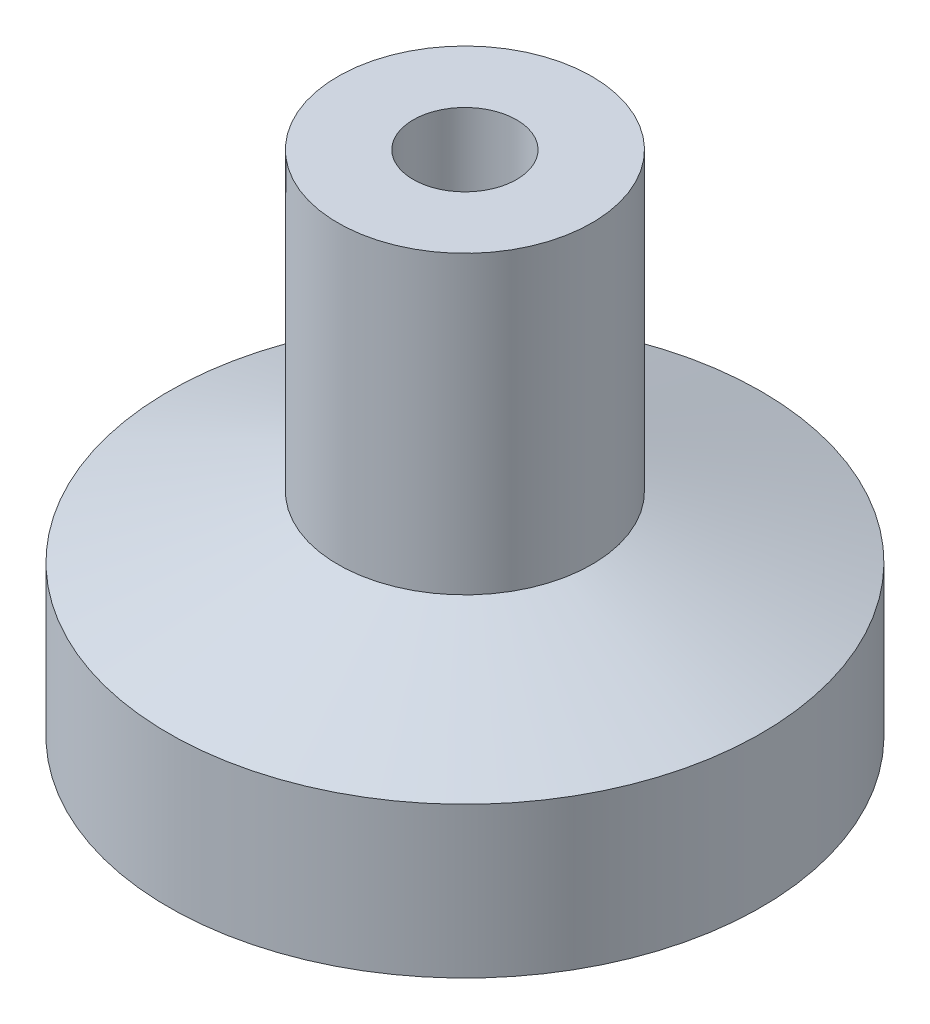
ISO-10303-21;
HEADER;
FILE_DESCRIPTION(('STEP AP214'),'2;1');
FILE_NAME('part.step','',(''),(''),'','','');
FILE_SCHEMA(('AUTOMOTIVE_DESIGN { 1 0 10303 214 1 1 1 1 }'));
ENDSEC;
DATA;
#1=APPLICATION_CONTEXT('core data for automotive mechanical design processes');
#2=APPLICATION_PROTOCOL_DEFINITION('international standard','automotive_design',2000,#1);
#3=PRODUCT_CONTEXT('',#1,'mechanical');
#4=PRODUCT('Part','Part','',(#3));
#5=PRODUCT_RELATED_PRODUCT_CATEGORY('part','',(#4));
#6=PRODUCT_DEFINITION_FORMATION('','',#4);
#7=PRODUCT_DEFINITION_CONTEXT('part definition',#1,'design');
#8=PRODUCT_DEFINITION('design','',#6,#7);
#9=PRODUCT_DEFINITION_SHAPE('','',#8);
#10=(LENGTH_UNIT() NAMED_UNIT(*) SI_UNIT(.MILLI.,.METRE.));
#11=(NAMED_UNIT(*) PLANE_ANGLE_UNIT() SI_UNIT($,.RADIAN.));
#12=(NAMED_UNIT(*) SI_UNIT($,.STERADIAN.) SOLID_ANGLE_UNIT());
#13=UNCERTAINTY_MEASURE_WITH_UNIT(LENGTH_MEASURE(1.E-05),#10,'distance_accuracy_value','');
#14=(GEOMETRIC_REPRESENTATION_CONTEXT(3) GLOBAL_UNCERTAINTY_ASSIGNED_CONTEXT((#13)) GLOBAL_UNIT_ASSIGNED_CONTEXT((#10,
#11,#12)) REPRESENTATION_CONTEXT('',''));
#15=CARTESIAN_POINT('',(0.,0.,0.));
#16=DIRECTION('',(0.,0.,1.));
#17=DIRECTION('',(1.,0.,0.));
#18=AXIS2_PLACEMENT_3D('',#15,#16,#17);
#19=CARTESIAN_POINT('',(0.,0.,0.));
#20=DIRECTION('',(0.,-1.,0.));
#21=DIRECTION('',(0.,0.,-1.));
#22=AXIS2_PLACEMENT_3D('',#19,#20,#21);
#23=CYLINDRICAL_SURFACE('',#22,2.75);
#24=CARTESIAN_POINT('',(0.,27.,0.));
#25=DIRECTION('',(0.,-1.,0.));
#26=DIRECTION('',(0.,0.,-1.));
#27=AXIS2_PLACEMENT_3D('',#24,#25,#26);
#28=CIRCLE('',#27,2.75);
#29=CARTESIAN_POINT('',(0.,27.,-2.75));
#30=VERTEX_POINT('',#29);
#31=EDGE_CURVE('E10',#30,#30,#28,.T.);
#32=ORIENTED_EDGE('',*,*,#31,.F.);
#33=EDGE_LOOP('',(#32));
#34=FACE_BOUND('',#33,.T.);
#35=CARTESIAN_POINT('',(0.,0.,0.));
#36=DIRECTION('',(0.,-1.,0.));
#37=DIRECTION('',(0.,0.,-1.));
#38=AXIS2_PLACEMENT_3D('',#35,#36,#37);
#39=CIRCLE('',#38,2.75);
#40=CARTESIAN_POINT('',(0.,0.,-2.75));
#41=VERTEX_POINT('',#40);
#42=EDGE_CURVE('E53',#41,#41,#39,.T.);
#43=ORIENTED_EDGE('',*,*,#42,.T.);
#44=EDGE_LOOP('',(#43));
#45=FACE_BOUND('',#44,.T.);
#46=ADVANCED_FACE('F31',(#34,#45),#23,.F.);
#47=CARTESIAN_POINT('',(-2.75,27.,0.));
#48=DIRECTION('',(0.,-1.,0.));
#49=DIRECTION('',(0.,0.,-1.));
#50=AXIS2_PLACEMENT_3D('',#47,#48,#49);
#51=PLANE('',#50);
#52=CARTESIAN_POINT('',(0.,27.,0.));
#53=DIRECTION('',(0.,-1.,0.));
#54=DIRECTION('',(0.,0.,-1.));
#55=AXIS2_PLACEMENT_3D('',#52,#53,#54);
#56=CIRCLE('',#55,6.75);
#57=CARTESIAN_POINT('',(0.,27.,-6.75));
#58=VERTEX_POINT('',#57);
#59=EDGE_CURVE('E37',#58,#58,#56,.T.);
#60=ORIENTED_EDGE('',*,*,#59,.F.);
#61=EDGE_LOOP('',(#60));
#62=FACE_BOUND('',#61,.T.);
#63=ORIENTED_EDGE('',*,*,#31,.T.);
#64=EDGE_LOOP('',(#63));
#65=FACE_BOUND('',#64,.T.);
#66=ADVANCED_FACE('F78',(#62,#65),#51,.F.);
#67=CARTESIAN_POINT('',(0.,0.,0.));
#68=DIRECTION('',(0.,-1.,0.));
#69=DIRECTION('',(0.,0.,-1.));
#70=AXIS2_PLACEMENT_3D('',#67,#68,#69);
#71=CYLINDRICAL_SURFACE('',#70,6.75);
#72=CARTESIAN_POINT('',(0.,11.2757321083958,0.));
#73=DIRECTION('',(0.,-1.,0.));
#74=DIRECTION('',(0.,0.,-1.));
#75=AXIS2_PLACEMENT_3D('',#72,#73,#74);
#76=CIRCLE('',#75,6.75);
#77=CARTESIAN_POINT('',(0.,11.2757321083958,-6.75));
#78=VERTEX_POINT('',#77);
#79=EDGE_CURVE('E41',#78,#78,#76,.T.);
#80=ORIENTED_EDGE('',*,*,#79,.F.);
#81=EDGE_LOOP('',(#80));
#82=FACE_BOUND('',#81,.T.);
#83=ORIENTED_EDGE('',*,*,#59,.T.);
#84=EDGE_LOOP('',(#83));
#85=FACE_BOUND('',#84,.T.);
#86=ADVANCED_FACE('F73',(#82,#85),#71,.T.);
#87=CARTESIAN_POINT('',(0.,11.2757321083958,0.));
#88=DIRECTION('',(0.,-1.,0.));
#89=DIRECTION('',(0.,0.,-1.));
#90=AXIS2_PLACEMENT_3D('',#87,#88,#89);
#91=CONICAL_SURFACE('',#90,6.75,1.22173047639604);
#92=CARTESIAN_POINT('',(0.,8.,0.));
#93=DIRECTION('',(0.,-1.,0.));
#94=DIRECTION('',(0.,0.,-1.));
#95=AXIS2_PLACEMENT_3D('',#92,#93,#94);
#96=CIRCLE('',#95,15.75);
#97=CARTESIAN_POINT('',(0.,8.,-15.75));
#98=VERTEX_POINT('',#97);
#99=EDGE_CURVE('E45',#98,#98,#96,.T.);
#100=ORIENTED_EDGE('',*,*,#99,.F.);
#101=EDGE_LOOP('',(#100));
#102=FACE_BOUND('',#101,.T.);
#103=ORIENTED_EDGE('',*,*,#79,.T.);
#104=EDGE_LOOP('',(#103));
#105=FACE_BOUND('',#104,.T.);
#106=ADVANCED_FACE('F67',(#102,#105),#91,.T.);
#107=CARTESIAN_POINT('',(0.,0.,0.));
#108=DIRECTION('',(0.,-1.,0.));
#109=DIRECTION('',(0.,0.,-1.));
#110=AXIS2_PLACEMENT_3D('',#107,#108,#109);
#111=CYLINDRICAL_SURFACE('',#110,15.75);
#112=CARTESIAN_POINT('',(0.,0.,0.));
#113=DIRECTION('',(0.,-1.,0.));
#114=DIRECTION('',(0.,0.,-1.));
#115=AXIS2_PLACEMENT_3D('',#112,#113,#114);
#116=CIRCLE('',#115,15.75);
#117=CARTESIAN_POINT('',(0.,0.,-15.75));
#118=VERTEX_POINT('',#117);
#119=EDGE_CURVE('E50',#118,#118,#116,.T.);
#120=ORIENTED_EDGE('',*,*,#119,.F.);
#121=EDGE_LOOP('',(#120));
#122=FACE_BOUND('',#121,.T.);
#123=ORIENTED_EDGE('',*,*,#99,.T.);
#124=EDGE_LOOP('',(#123));
#125=FACE_BOUND('',#124,.T.);
#126=ADVANCED_FACE('F61',(#122,#125),#111,.T.);
#127=CARTESIAN_POINT('',(-2.75,0.,0.));
#128=DIRECTION('',(0.,1.,0.));
#129=DIRECTION('',(0.,0.,1.));
#130=AXIS2_PLACEMENT_3D('',#127,#128,#129);
#131=PLANE('',#130);
#132=ORIENTED_EDGE('',*,*,#42,.F.);
#133=EDGE_LOOP('',(#132));
#134=FACE_BOUND('',#133,.T.);
#135=ORIENTED_EDGE('',*,*,#119,.T.);
#136=EDGE_LOOP('',(#135));
#137=FACE_BOUND('',#136,.T.);
#138=ADVANCED_FACE('F58',(#134,#137),#131,.F.);
#139=CLOSED_SHELL('',(#46,#66,#86,#106,#126,#138));
#140=MANIFOLD_SOLID_BREP('B2',#139);
#141=ADVANCED_BREP_SHAPE_REPRESENTATION('',(#18,#140),#14);
#142=SHAPE_DEFINITION_REPRESENTATION(#9,#141);
ENDSEC;
END-ISO-10303-21;
